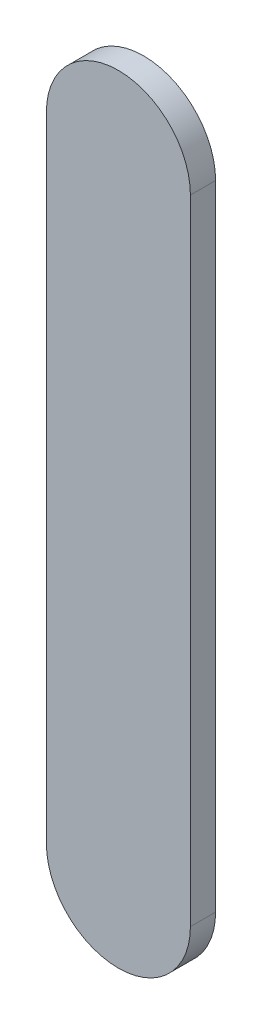
ISO-10303-21;
HEADER;
FILE_DESCRIPTION(('STEP AP214'),'2;1');
FILE_NAME('part.step','',(''),(''),'','','');
FILE_SCHEMA(('AUTOMOTIVE_DESIGN { 1 0 10303 214 1 1 1 1 }'));
ENDSEC;
DATA;
#1=APPLICATION_CONTEXT('core data for automotive mechanical design processes');
#2=APPLICATION_PROTOCOL_DEFINITION('international standard','automotive_design',2000,#1);
#3=PRODUCT_CONTEXT('',#1,'mechanical');
#4=PRODUCT('Part','Part','',(#3));
#5=PRODUCT_RELATED_PRODUCT_CATEGORY('part','',(#4));
#6=PRODUCT_DEFINITION_FORMATION('','',#4);
#7=PRODUCT_DEFINITION_CONTEXT('part definition',#1,'design');
#8=PRODUCT_DEFINITION('design','',#6,#7);
#9=PRODUCT_DEFINITION_SHAPE('','',#8);
#10=(LENGTH_UNIT() NAMED_UNIT(*) SI_UNIT(.MILLI.,.METRE.));
#11=(NAMED_UNIT(*) PLANE_ANGLE_UNIT() SI_UNIT($,.RADIAN.));
#12=(NAMED_UNIT(*) SI_UNIT($,.STERADIAN.) SOLID_ANGLE_UNIT());
#13=UNCERTAINTY_MEASURE_WITH_UNIT(LENGTH_MEASURE(1.E-05),#10,'distance_accuracy_value','');
#14=(GEOMETRIC_REPRESENTATION_CONTEXT(3) GLOBAL_UNCERTAINTY_ASSIGNED_CONTEXT((#13)) GLOBAL_UNIT_ASSIGNED_CONTEXT((#10,
#11,#12)) REPRESENTATION_CONTEXT('',''));
#15=CARTESIAN_POINT('',(0.,0.,0.));
#16=DIRECTION('',(0.,0.,1.));
#17=DIRECTION('',(1.,0.,0.));
#18=AXIS2_PLACEMENT_3D('',#15,#16,#17);
#19=CARTESIAN_POINT('',(102.21,-120.52,1.635));
#20=DIRECTION('',(0.,0.,1.));
#21=DIRECTION('',(1.,0.,0.));
#22=AXIS2_PLACEMENT_3D('',#19,#20,#21);
#23=PLANE('',#22);
#24=DIRECTION('',(0.,-1.,0.));
#25=VECTOR('',#24,1.);
#26=CARTESIAN_POINT('',(102.21,-120.52,1.635));
#27=LINE('',#26,#25);
#28=CARTESIAN_POINT('',(102.21,-120.52,1.635));
#29=VERTEX_POINT('',#28);
#30=CARTESIAN_POINT('',(102.21,-121.4,1.635));
#31=VERTEX_POINT('',#30);
#32=EDGE_CURVE('E80',#29,#31,#27,.T.);
#33=ORIENTED_EDGE('',*,*,#32,.T.);
#34=CARTESIAN_POINT('',(102.31,-121.4,1.635));
#35=DIRECTION('',(0.,0.,1.));
#36=DIRECTION('',(-1.,-1.42108547152E-13,0.));
#37=AXIS2_PLACEMENT_3D('',#34,#35,#36);
#38=CIRCLE('',#37,0.1);
#39=CARTESIAN_POINT('',(102.41,-121.4,1.635));
#40=VERTEX_POINT('',#39);
#41=EDGE_CURVE('E108',#31,#40,#38,.T.);
#42=ORIENTED_EDGE('',*,*,#41,.T.);
#43=DIRECTION('',(0.,1.,0.));
#44=VECTOR('',#43,1.);
#45=CARTESIAN_POINT('',(102.41,-121.4,1.635));
#46=LINE('',#45,#44);
#47=CARTESIAN_POINT('',(102.41,-120.52,1.635));
#48=VERTEX_POINT('',#47);
#49=EDGE_CURVE('E73',#40,#48,#46,.T.);
#50=ORIENTED_EDGE('',*,*,#49,.T.);
#51=CARTESIAN_POINT('',(102.31,-120.52,1.635));
#52=DIRECTION('',(0.,0.,1.));
#53=DIRECTION('',(1.,1.42108547152E-13,0.));
#54=AXIS2_PLACEMENT_3D('',#51,#52,#53);
#55=CIRCLE('',#54,0.1);
#56=EDGE_CURVE('E11',#48,#29,#55,.T.);
#57=ORIENTED_EDGE('',*,*,#56,.T.);
#58=EDGE_LOOP('',(#33,#42,#50,#57));
#59=FACE_BOUND('',#58,.T.);
#60=ADVANCED_FACE('F17',(#59),#23,.T.);
#61=CARTESIAN_POINT('',(102.21,-120.52,1.6));
#62=DIRECTION('',(0.,0.,1.));
#63=DIRECTION('',(1.,0.,0.));
#64=AXIS2_PLACEMENT_3D('',#61,#62,#63);
#65=PLANE('',#64);
#66=CARTESIAN_POINT('',(102.31,-120.52,1.6));
#67=DIRECTION('',(0.,0.,1.));
#68=DIRECTION('',(1.,1.42108547152E-13,0.));
#69=AXIS2_PLACEMENT_3D('',#66,#67,#68);
#70=CIRCLE('',#69,0.1);
#71=CARTESIAN_POINT('',(102.41,-120.52,1.6));
#72=VERTEX_POINT('',#71);
#73=CARTESIAN_POINT('',(102.21,-120.52,1.6));
#74=VERTEX_POINT('',#73);
#75=EDGE_CURVE('E27',#72,#74,#70,.T.);
#76=ORIENTED_EDGE('',*,*,#75,.F.);
#77=DIRECTION('',(0.,1.,0.));
#78=VECTOR('',#77,1.);
#79=CARTESIAN_POINT('',(102.41,-121.4,1.6));
#80=LINE('',#79,#78);
#81=CARTESIAN_POINT('',(102.41,-121.4,1.6));
#82=VERTEX_POINT('',#81);
#83=EDGE_CURVE('E99',#82,#72,#80,.T.);
#84=ORIENTED_EDGE('',*,*,#83,.F.);
#85=CARTESIAN_POINT('',(102.31,-121.4,1.6));
#86=DIRECTION('',(0.,0.,1.));
#87=DIRECTION('',(-1.,-1.42108547152E-13,0.));
#88=AXIS2_PLACEMENT_3D('',#85,#86,#87);
#89=CIRCLE('',#88,0.1);
#90=CARTESIAN_POINT('',(102.21,-121.4,1.6));
#91=VERTEX_POINT('',#90);
#92=EDGE_CURVE('E82',#91,#82,#89,.T.);
#93=ORIENTED_EDGE('',*,*,#92,.F.);
#94=DIRECTION('',(0.,-1.,0.));
#95=VECTOR('',#94,1.);
#96=CARTESIAN_POINT('',(102.21,-120.52,1.6));
#97=LINE('',#96,#95);
#98=EDGE_CURVE('E78',#74,#91,#97,.T.);
#99=ORIENTED_EDGE('',*,*,#98,.F.);
#100=EDGE_LOOP('',(#76,#84,#93,#99));
#101=FACE_BOUND('',#100,.T.);
#102=ADVANCED_FACE('F19',(#101),#65,.F.);
#103=CARTESIAN_POINT('',(102.31,-120.52,1.6));
#104=DIRECTION('',(0.,0.,-1.));
#105=DIRECTION('',(1.,1.42108547152E-13,0.));
#106=AXIS2_PLACEMENT_3D('',#103,#104,#105);
#107=CYLINDRICAL_SURFACE('',#106,0.1);
#108=ORIENTED_EDGE('',*,*,#75,.T.);
#109=DIRECTION('',(0.,0.,1.));
#110=VECTOR('',#109,1.);
#111=CARTESIAN_POINT('',(102.21,-120.52,1.6));
#112=LINE('',#111,#110);
#113=EDGE_CURVE('E65',#74,#29,#112,.T.);
#114=ORIENTED_EDGE('',*,*,#113,.T.);
#115=ORIENTED_EDGE('',*,*,#56,.F.);
#116=DIRECTION('',(0.,0.,1.));
#117=VECTOR('',#116,1.);
#118=CARTESIAN_POINT('',(102.41,-120.52,1.6));
#119=LINE('',#118,#117);
#120=EDGE_CURVE('E68',#72,#48,#119,.T.);
#121=ORIENTED_EDGE('',*,*,#120,.F.);
#122=EDGE_LOOP('',(#108,#114,#115,#121));
#123=FACE_BOUND('',#122,.T.);
#124=ADVANCED_FACE('F64',(#123),#107,.T.);
#125=CARTESIAN_POINT('',(102.41,-121.4,1.6));
#126=DIRECTION('',(-1.,0.,0.));
#127=DIRECTION('',(0.,0.,1.));
#128=AXIS2_PLACEMENT_3D('',#125,#126,#127);
#129=PLANE('',#128);
#130=ORIENTED_EDGE('',*,*,#83,.T.);
#131=ORIENTED_EDGE('',*,*,#120,.T.);
#132=ORIENTED_EDGE('',*,*,#49,.F.);
#133=DIRECTION('',(0.,0.,1.));
#134=VECTOR('',#133,1.);
#135=CARTESIAN_POINT('',(102.41,-121.4,1.6));
#136=LINE('',#135,#134);
#137=EDGE_CURVE('E96',#82,#40,#136,.T.);
#138=ORIENTED_EDGE('',*,*,#137,.F.);
#139=EDGE_LOOP('',(#130,#131,#132,#138));
#140=FACE_BOUND('',#139,.T.);
#141=ADVANCED_FACE('F117',(#140),#129,.F.);
#142=CARTESIAN_POINT('',(102.31,-121.4,1.6));
#143=DIRECTION('',(0.,0.,-1.));
#144=DIRECTION('',(-1.,-1.42108547152E-13,0.));
#145=AXIS2_PLACEMENT_3D('',#142,#143,#144);
#146=CYLINDRICAL_SURFACE('',#145,0.1);
#147=ORIENTED_EDGE('',*,*,#92,.T.);
#148=ORIENTED_EDGE('',*,*,#137,.T.);
#149=ORIENTED_EDGE('',*,*,#41,.F.);
#150=DIRECTION('',(0.,0.,1.));
#151=VECTOR('',#150,1.);
#152=CARTESIAN_POINT('',(102.21,-121.4,1.6));
#153=LINE('',#152,#151);
#154=EDGE_CURVE('E87',#91,#31,#153,.T.);
#155=ORIENTED_EDGE('',*,*,#154,.F.);
#156=EDGE_LOOP('',(#147,#148,#149,#155));
#157=FACE_BOUND('',#156,.T.);
#158=ADVANCED_FACE('F119',(#157),#146,.T.);
#159=CARTESIAN_POINT('',(102.21,-120.52,1.6));
#160=DIRECTION('',(1.,0.,0.));
#161=DIRECTION('',(0.,1.,0.));
#162=AXIS2_PLACEMENT_3D('',#159,#160,#161);
#163=PLANE('',#162);
#164=ORIENTED_EDGE('',*,*,#98,.T.);
#165=ORIENTED_EDGE('',*,*,#154,.T.);
#166=ORIENTED_EDGE('',*,*,#32,.F.);
#167=ORIENTED_EDGE('',*,*,#113,.F.);
#168=EDGE_LOOP('',(#164,#165,#166,#167));
#169=FACE_BOUND('',#168,.T.);
#170=ADVANCED_FACE('F76',(#169),#163,.F.);
#171=CLOSED_SHELL('',(#60,#102,#124,#141,#158,#170));
#172=MANIFOLD_SOLID_BREP('B1',#171);
#173=ADVANCED_BREP_SHAPE_REPRESENTATION('',(#18,#172),#14);
#174=SHAPE_DEFINITION_REPRESENTATION(#9,#173);
ENDSEC;
END-ISO-10303-21;
